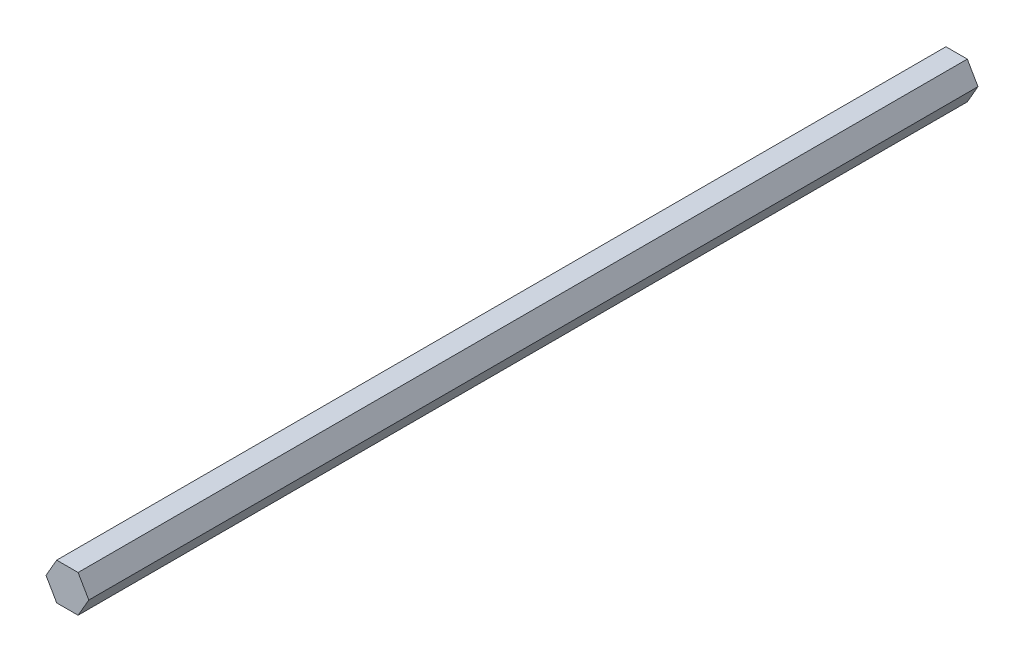
ISO-10303-21;
HEADER;
FILE_DESCRIPTION(('STEP AP214'),'2;1');
FILE_NAME('part.step','',(''),(''),'','','');
FILE_SCHEMA(('AUTOMOTIVE_DESIGN { 1 0 10303 214 1 1 1 1 }'));
ENDSEC;
DATA;
#1=APPLICATION_CONTEXT('core data for automotive mechanical design processes');
#2=APPLICATION_PROTOCOL_DEFINITION('international standard','automotive_design',2000,#1);
#3=PRODUCT_CONTEXT('',#1,'mechanical');
#4=PRODUCT('Part','Part','',(#3));
#5=PRODUCT_RELATED_PRODUCT_CATEGORY('part','',(#4));
#6=PRODUCT_DEFINITION_FORMATION('','',#4);
#7=PRODUCT_DEFINITION_CONTEXT('part definition',#1,'design');
#8=PRODUCT_DEFINITION('design','',#6,#7);
#9=PRODUCT_DEFINITION_SHAPE('','',#8);
#10=(LENGTH_UNIT() NAMED_UNIT(*) SI_UNIT(.MILLI.,.METRE.));
#11=(NAMED_UNIT(*) PLANE_ANGLE_UNIT() SI_UNIT($,.RADIAN.));
#12=(NAMED_UNIT(*) SI_UNIT($,.STERADIAN.) SOLID_ANGLE_UNIT());
#13=UNCERTAINTY_MEASURE_WITH_UNIT(LENGTH_MEASURE(1.E-05),#10,'distance_accuracy_value','');
#14=(GEOMETRIC_REPRESENTATION_CONTEXT(3) GLOBAL_UNCERTAINTY_ASSIGNED_CONTEXT((#13)) GLOBAL_UNIT_ASSIGNED_CONTEXT((#10,
#11,#12)) REPRESENTATION_CONTEXT('',''));
#15=CARTESIAN_POINT('',(0.,0.,0.));
#16=DIRECTION('',(0.,0.,1.));
#17=DIRECTION('',(1.,0.,0.));
#18=AXIS2_PLACEMENT_3D('',#15,#16,#17);
#19=CARTESIAN_POINT('',(3.66617420935412,-6.35000000000001,152.4));
#20=DIRECTION('',(-0.866025403784439,0.499999999999999,0.));
#21=DIRECTION('',(-0.499999999999999,-0.866025403784439,0.));
#22=AXIS2_PLACEMENT_3D('',#19,#20,#21);
#23=PLANE('',#22);
#24=DIRECTION('',(0.499999999999999,0.866025403784439,0.));
#25=VECTOR('',#24,1.);
#26=CARTESIAN_POINT('',(3.66617420935412,-6.35000000000001,-152.4));
#27=LINE('',#26,#25);
#28=CARTESIAN_POINT('',(3.66617420935412,-6.35000000000001,-152.4));
#29=VERTEX_POINT('',#28);
#30=CARTESIAN_POINT('',(7.33234841870825,0.,-152.4));
#31=VERTEX_POINT('',#30);
#32=EDGE_CURVE('E128',#29,#31,#27,.T.);
#33=ORIENTED_EDGE('',*,*,#32,.T.);
#34=DIRECTION('',(0.,0.,-1.));
#35=VECTOR('',#34,1.);
#36=CARTESIAN_POINT('',(7.33234841870825,0.,152.4));
#37=LINE('',#36,#35);
#38=CARTESIAN_POINT('',(7.33234841870825,0.,152.4));
#39=VERTEX_POINT('',#38);
#40=EDGE_CURVE('E11',#39,#31,#37,.T.);
#41=ORIENTED_EDGE('',*,*,#40,.F.);
#42=DIRECTION('',(0.499999999999999,0.866025403784439,0.));
#43=VECTOR('',#42,1.);
#44=CARTESIAN_POINT('',(3.66617420935412,-6.35000000000001,152.4));
#45=LINE('',#44,#43);
#46=CARTESIAN_POINT('',(3.66617420935412,-6.35000000000001,152.4));
#47=VERTEX_POINT('',#46);
#48=EDGE_CURVE('E144',#47,#39,#45,.T.);
#49=ORIENTED_EDGE('',*,*,#48,.F.);
#50=DIRECTION('',(0.,0.,-1.));
#51=VECTOR('',#50,1.);
#52=CARTESIAN_POINT('',(3.66617420935412,-6.35000000000001,152.4));
#53=LINE('',#52,#51);
#54=EDGE_CURVE('E124',#47,#29,#53,.T.);
#55=ORIENTED_EDGE('',*,*,#54,.T.);
#56=EDGE_LOOP('',(#33,#41,#49,#55));
#57=FACE_BOUND('',#56,.T.);
#58=ADVANCED_FACE('F39',(#57),#23,.F.);
#59=CARTESIAN_POINT('',(7.33234841870825,0.,152.4));
#60=DIRECTION('',(-0.866025403784438,-0.5,0.));
#61=DIRECTION('',(0.5,-0.866025403784438,0.));
#62=AXIS2_PLACEMENT_3D('',#59,#60,#61);
#63=PLANE('',#62);
#64=DIRECTION('',(-0.5,0.866025403784438,0.));
#65=VECTOR('',#64,1.);
#66=CARTESIAN_POINT('',(7.33234841870825,0.,-152.4));
#67=LINE('',#66,#65);
#68=CARTESIAN_POINT('',(3.66617420935412,6.35,-152.4));
#69=VERTEX_POINT('',#68);
#70=EDGE_CURVE('E132',#31,#69,#67,.T.);
#71=ORIENTED_EDGE('',*,*,#70,.T.);
#72=DIRECTION('',(0.,0.,-1.));
#73=VECTOR('',#72,1.);
#74=CARTESIAN_POINT('',(3.66617420935412,6.35,152.4));
#75=LINE('',#74,#73);
#76=CARTESIAN_POINT('',(3.66617420935412,6.35,152.4));
#77=VERTEX_POINT('',#76);
#78=EDGE_CURVE('E48',#77,#69,#75,.T.);
#79=ORIENTED_EDGE('',*,*,#78,.F.);
#80=DIRECTION('',(-0.5,0.866025403784438,0.));
#81=VECTOR('',#80,1.);
#82=CARTESIAN_POINT('',(7.33234841870825,0.,152.4));
#83=LINE('',#82,#81);
#84=EDGE_CURVE('E93',#39,#77,#83,.T.);
#85=ORIENTED_EDGE('',*,*,#84,.F.);
#86=ORIENTED_EDGE('',*,*,#40,.T.);
#87=EDGE_LOOP('',(#71,#79,#85,#86));
#88=FACE_BOUND('',#87,.T.);
#89=ADVANCED_FACE('F172',(#88),#63,.F.);
#90=CARTESIAN_POINT('',(3.66617420935412,6.35,152.4));
#91=DIRECTION('',(0.,-1.,0.));
#92=DIRECTION('',(0.,0.,-1.));
#93=AXIS2_PLACEMENT_3D('',#90,#91,#92);
#94=PLANE('',#93);
#95=DIRECTION('',(-1.,0.,0.));
#96=VECTOR('',#95,1.);
#97=CARTESIAN_POINT('',(3.66617420935412,6.35,-152.4));
#98=LINE('',#97,#96);
#99=CARTESIAN_POINT('',(-3.66617420935412,6.35,-152.4));
#100=VERTEX_POINT('',#99);
#101=EDGE_CURVE('E135',#69,#100,#98,.T.);
#102=ORIENTED_EDGE('',*,*,#101,.T.);
#103=DIRECTION('',(0.,0.,-1.));
#104=VECTOR('',#103,1.);
#105=CARTESIAN_POINT('',(-3.66617420935412,6.35,152.4));
#106=LINE('',#105,#104);
#107=CARTESIAN_POINT('',(-3.66617420935412,6.35,152.4));
#108=VERTEX_POINT('',#107);
#109=EDGE_CURVE('E117',#108,#100,#106,.T.);
#110=ORIENTED_EDGE('',*,*,#109,.F.);
#111=DIRECTION('',(-1.,0.,0.));
#112=VECTOR('',#111,1.);
#113=CARTESIAN_POINT('',(3.66617420935412,6.35,152.4));
#114=LINE('',#113,#112);
#115=EDGE_CURVE('E106',#77,#108,#114,.T.);
#116=ORIENTED_EDGE('',*,*,#115,.F.);
#117=ORIENTED_EDGE('',*,*,#78,.T.);
#118=EDGE_LOOP('',(#102,#110,#116,#117));
#119=FACE_BOUND('',#118,.T.);
#120=ADVANCED_FACE('F154',(#119),#94,.F.);
#121=CARTESIAN_POINT('',(-3.66617420935412,6.35,152.4));
#122=DIRECTION('',(0.866025403784439,-0.5,0.));
#123=DIRECTION('',(0.5,0.866025403784439,0.));
#124=AXIS2_PLACEMENT_3D('',#121,#122,#123);
#125=PLANE('',#124);
#126=DIRECTION('',(-0.5,-0.866025403784439,0.));
#127=VECTOR('',#126,1.);
#128=CARTESIAN_POINT('',(-3.66617420935412,6.35,-152.4));
#129=LINE('',#128,#127);
#130=CARTESIAN_POINT('',(-7.33234841870824,0.,-152.4));
#131=VERTEX_POINT('',#130);
#132=EDGE_CURVE('E115',#100,#131,#129,.T.);
#133=ORIENTED_EDGE('',*,*,#132,.T.);
#134=DIRECTION('',(0.,0.,-1.));
#135=VECTOR('',#134,1.);
#136=CARTESIAN_POINT('',(-7.33234841870824,0.,152.4));
#137=LINE('',#136,#135);
#138=CARTESIAN_POINT('',(-7.33234841870824,0.,152.4));
#139=VERTEX_POINT('',#138);
#140=EDGE_CURVE('E112',#139,#131,#137,.T.);
#141=ORIENTED_EDGE('',*,*,#140,.F.);
#142=DIRECTION('',(-0.5,-0.866025403784439,0.));
#143=VECTOR('',#142,1.);
#144=CARTESIAN_POINT('',(-3.66617420935412,6.35,152.4));
#145=LINE('',#144,#143);
#146=EDGE_CURVE('E100',#108,#139,#145,.T.);
#147=ORIENTED_EDGE('',*,*,#146,.F.);
#148=ORIENTED_EDGE('',*,*,#109,.T.);
#149=EDGE_LOOP('',(#133,#141,#147,#148));
#150=FACE_BOUND('',#149,.T.);
#151=ADVANCED_FACE('F113',(#150),#125,.F.);
#152=CARTESIAN_POINT('',(-7.33234841870824,0.,152.4));
#153=DIRECTION('',(0.866025403784438,0.5,0.));
#154=DIRECTION('',(-0.5,0.866025403784438,0.));
#155=AXIS2_PLACEMENT_3D('',#152,#153,#154);
#156=PLANE('',#155);
#157=DIRECTION('',(0.500000000000001,-0.866025403784438,0.));
#158=VECTOR('',#157,1.);
#159=CARTESIAN_POINT('',(-7.33234841870824,0.,-152.4));
#160=LINE('',#159,#158);
#161=CARTESIAN_POINT('',(-3.66617420935411,-6.35,-152.4));
#162=VERTEX_POINT('',#161);
#163=EDGE_CURVE('E79',#131,#162,#160,.T.);
#164=ORIENTED_EDGE('',*,*,#163,.T.);
#165=DIRECTION('',(0.,0.,-1.));
#166=VECTOR('',#165,1.);
#167=CARTESIAN_POINT('',(-3.66617420935411,-6.35,152.4));
#168=LINE('',#167,#166);
#169=CARTESIAN_POINT('',(-3.66617420935411,-6.35,152.4));
#170=VERTEX_POINT('',#169);
#171=EDGE_CURVE('E118',#170,#162,#168,.T.);
#172=ORIENTED_EDGE('',*,*,#171,.F.);
#173=DIRECTION('',(0.500000000000001,-0.866025403784438,0.));
#174=VECTOR('',#173,1.);
#175=CARTESIAN_POINT('',(-7.33234841870824,0.,152.4));
#176=LINE('',#175,#174);
#177=EDGE_CURVE('E104',#139,#170,#176,.T.);
#178=ORIENTED_EDGE('',*,*,#177,.F.);
#179=ORIENTED_EDGE('',*,*,#140,.T.);
#180=EDGE_LOOP('',(#164,#172,#178,#179));
#181=FACE_BOUND('',#180,.T.);
#182=ADVANCED_FACE('F120',(#181),#156,.F.);
#183=CARTESIAN_POINT('',(-3.66617420935411,-6.35,152.4));
#184=DIRECTION('',(0.,1.,0.));
#185=DIRECTION('',(-1.,0.,0.));
#186=AXIS2_PLACEMENT_3D('',#183,#184,#185);
#187=PLANE('',#186);
#188=DIRECTION('',(1.,0.,0.));
#189=VECTOR('',#188,1.);
#190=CARTESIAN_POINT('',(-3.66617420935411,-6.35,-152.4));
#191=LINE('',#190,#189);
#192=EDGE_CURVE('E85',#162,#29,#191,.T.);
#193=ORIENTED_EDGE('',*,*,#192,.T.);
#194=ORIENTED_EDGE('',*,*,#54,.F.);
#195=DIRECTION('',(1.,0.,0.));
#196=VECTOR('',#195,1.);
#197=CARTESIAN_POINT('',(-3.66617420935411,-6.35,152.4));
#198=LINE('',#197,#196);
#199=EDGE_CURVE('E56',#170,#47,#198,.T.);
#200=ORIENTED_EDGE('',*,*,#199,.F.);
#201=ORIENTED_EDGE('',*,*,#171,.T.);
#202=EDGE_LOOP('',(#193,#194,#200,#201));
#203=FACE_BOUND('',#202,.T.);
#204=ADVANCED_FACE('F161',(#203),#187,.F.);
#205=CARTESIAN_POINT('',(7.33234841870824,0.,152.4));
#206=DIRECTION('',(0.,0.,1.));
#207=DIRECTION('',(1.,0.,0.));
#208=AXIS2_PLACEMENT_3D('',#205,#206,#207);
#209=PLANE('',#208);
#210=ORIENTED_EDGE('',*,*,#48,.T.);
#211=ORIENTED_EDGE('',*,*,#84,.T.);
#212=ORIENTED_EDGE('',*,*,#115,.T.);
#213=ORIENTED_EDGE('',*,*,#146,.T.);
#214=ORIENTED_EDGE('',*,*,#177,.T.);
#215=ORIENTED_EDGE('',*,*,#199,.T.);
#216=EDGE_LOOP('',(#210,#211,#212,#213,#214,#215));
#217=FACE_BOUND('',#216,.T.);
#218=ADVANCED_FACE('F102',(#217),#209,.T.);
#219=CARTESIAN_POINT('',(7.33234841870824,0.,-152.4));
#220=DIRECTION('',(0.,0.,1.));
#221=DIRECTION('',(1.,0.,0.));
#222=AXIS2_PLACEMENT_3D('',#219,#220,#221);
#223=PLANE('',#222);
#224=ORIENTED_EDGE('',*,*,#32,.F.);
#225=ORIENTED_EDGE('',*,*,#192,.F.);
#226=ORIENTED_EDGE('',*,*,#163,.F.);
#227=ORIENTED_EDGE('',*,*,#132,.F.);
#228=ORIENTED_EDGE('',*,*,#101,.F.);
#229=ORIENTED_EDGE('',*,*,#70,.F.);
#230=EDGE_LOOP('',(#224,#225,#226,#227,#228,#229));
#231=FACE_BOUND('',#230,.T.);
#232=ADVANCED_FACE('F157',(#231),#223,.F.);
#233=CLOSED_SHELL('',(#58,#89,#120,#151,#182,#204,#218,#232));
#234=MANIFOLD_SOLID_BREP('B2',#233);
#235=ADVANCED_BREP_SHAPE_REPRESENTATION('',(#18,#234),#14);
#236=SHAPE_DEFINITION_REPRESENTATION(#9,#235);
ENDSEC;
END-ISO-10303-21;
